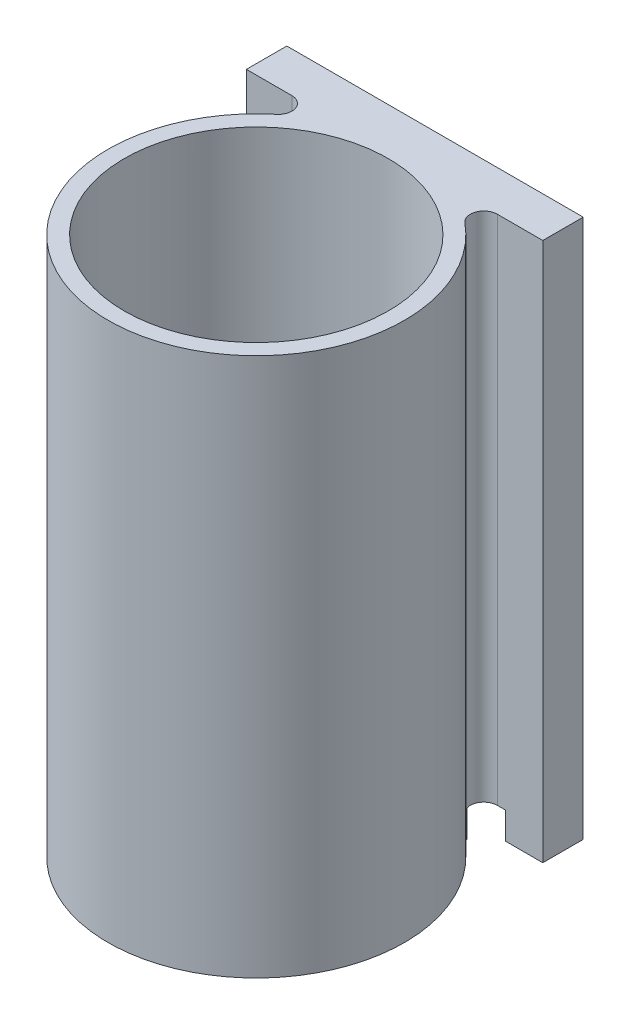
ISO-10303-21;
HEADER;
FILE_DESCRIPTION(('STEP AP214'),'2;1');
FILE_NAME('part.step','',(''),(''),'','','');
FILE_SCHEMA(('AUTOMOTIVE_DESIGN { 1 0 10303 214 1 1 1 1 }'));
ENDSEC;
DATA;
#1=APPLICATION_CONTEXT('core data for automotive mechanical design processes');
#2=APPLICATION_PROTOCOL_DEFINITION('international standard','automotive_design',2000,#1);
#3=PRODUCT_CONTEXT('',#1,'mechanical');
#4=PRODUCT('Part','Part','',(#3));
#5=PRODUCT_RELATED_PRODUCT_CATEGORY('part','',(#4));
#6=PRODUCT_DEFINITION_FORMATION('','',#4);
#7=PRODUCT_DEFINITION_CONTEXT('part definition',#1,'design');
#8=PRODUCT_DEFINITION('design','',#6,#7);
#9=PRODUCT_DEFINITION_SHAPE('','',#8);
#10=(LENGTH_UNIT() NAMED_UNIT(*) SI_UNIT(.MILLI.,.METRE.));
#11=(NAMED_UNIT(*) PLANE_ANGLE_UNIT() SI_UNIT($,.RADIAN.));
#12=(NAMED_UNIT(*) SI_UNIT($,.STERADIAN.) SOLID_ANGLE_UNIT());
#13=UNCERTAINTY_MEASURE_WITH_UNIT(LENGTH_MEASURE(1.E-05),#10,'distance_accuracy_value','');
#14=(GEOMETRIC_REPRESENTATION_CONTEXT(3) GLOBAL_UNCERTAINTY_ASSIGNED_CONTEXT((#13)) GLOBAL_UNIT_ASSIGNED_CONTEXT((#10,
#11,#12)) REPRESENTATION_CONTEXT('',''));
#15=CARTESIAN_POINT('',(0.,0.,0.));
#16=DIRECTION('',(0.,0.,1.));
#17=DIRECTION('',(1.,0.,0.));
#18=AXIS2_PLACEMENT_3D('',#15,#16,#17);
#19=CARTESIAN_POINT('',(-11.,-20.,3.));
#20=DIRECTION('',(0.,1.,0.));
#21=DIRECTION('',(0.,0.,1.));
#22=AXIS2_PLACEMENT_3D('',#19,#20,#21);
#23=PLANE('',#22);
#24=DIRECTION('',(1.,0.,0.));
#25=VECTOR('',#24,1.);
#26=CARTESIAN_POINT('',(-11.,-20.,3.));
#27=LINE('',#26,#25);
#28=CARTESIAN_POINT('',(8.23143797908715,-20.,3.));
#29=VERTEX_POINT('',#28);
#30=CARTESIAN_POINT('',(11.,-20.,3.));
#31=VERTEX_POINT('',#30);
#32=EDGE_CURVE('E160',#29,#31,#27,.T.);
#33=ORIENTED_EDGE('',*,*,#32,.F.);
#34=DIRECTION('',(0.,0.,1.));
#35=VECTOR('',#34,1.);
#36=CARTESIAN_POINT('',(8.23143797908715,-20.,-4.29535614519713));
#37=LINE('',#36,#35);
#38=CARTESIAN_POINT('',(8.23143797908715,-20.,0.));
#39=VERTEX_POINT('',#38);
#40=EDGE_CURVE('E148',#39,#29,#37,.T.);
#41=ORIENTED_EDGE('',*,*,#40,.F.);
#42=DIRECTION('',(1.,0.,0.));
#43=VECTOR('',#42,1.);
#44=CARTESIAN_POINT('',(-11.,-20.,0.));
#45=LINE('',#44,#43);
#46=CARTESIAN_POINT('',(11.,-20.,0.));
#47=VERTEX_POINT('',#46);
#48=EDGE_CURVE('E158',#39,#47,#45,.T.);
#49=ORIENTED_EDGE('',*,*,#48,.T.);
#50=DIRECTION('',(0.,0.,-1.));
#51=VECTOR('',#50,1.);
#52=CARTESIAN_POINT('',(11.,-20.,3.));
#53=LINE('',#52,#51);
#54=EDGE_CURVE('E176',#31,#47,#53,.T.);
#55=ORIENTED_EDGE('',*,*,#54,.F.);
#56=EDGE_LOOP('',(#33,#41,#49,#55));
#57=FACE_BOUND('',#56,.T.);
#58=ADVANCED_FACE('F33',(#57),#23,.F.);
#59=CARTESIAN_POINT('',(-11.,-20.,0.));
#60=VERTEX_POINT('',#59);
#61=CARTESIAN_POINT('',(-8.23143797908715,-20.,0.));
#62=VERTEX_POINT('',#61);
#63=EDGE_CURVE('E167',#60,#62,#45,.T.);
#64=ORIENTED_EDGE('',*,*,#63,.T.);
#65=DIRECTION('',(0.,0.,-1.));
#66=VECTOR('',#65,1.);
#67=CARTESIAN_POINT('',(-8.23143797908715,-20.,-4.29535614519713));
#68=LINE('',#67,#66);
#69=CARTESIAN_POINT('',(-8.23143797908715,-20.,3.));
#70=VERTEX_POINT('',#69);
#71=EDGE_CURVE('E223',#70,#62,#68,.T.);
#72=ORIENTED_EDGE('',*,*,#71,.F.);
#73=CARTESIAN_POINT('',(-11.,-20.,3.));
#74=VERTEX_POINT('',#73);
#75=EDGE_CURVE('E179',#74,#70,#27,.T.);
#76=ORIENTED_EDGE('',*,*,#75,.F.);
#77=DIRECTION('',(0.,0.,-1.));
#78=VECTOR('',#77,1.);
#79=CARTESIAN_POINT('',(-11.,-20.,3.));
#80=LINE('',#79,#78);
#81=EDGE_CURVE('E178',#74,#60,#80,.T.);
#82=ORIENTED_EDGE('',*,*,#81,.T.);
#83=EDGE_LOOP('',(#64,#72,#76,#82));
#84=FACE_BOUND('',#83,.T.);
#85=ADVANCED_FACE('F221',(#84),#23,.F.);
#86=CARTESIAN_POINT('',(0.,0.,3.));
#87=DIRECTION('',(0.,0.,1.));
#88=DIRECTION('',(1.,0.,0.));
#89=AXIS2_PLACEMENT_3D('',#86,#87,#88);
#90=PLANE('',#89);
#91=DIRECTION('',(0.,1.,0.));
#92=VECTOR('',#91,1.);
#93=CARTESIAN_POINT('',(8.23143797908715,0.,3.));
#94=LINE('',#93,#92);
#95=CARTESIAN_POINT('',(8.23143797908715,-18.,3.));
#96=VERTEX_POINT('',#95);
#97=EDGE_CURVE('E258',#29,#96,#94,.T.);
#98=ORIENTED_EDGE('',*,*,#97,.F.);
#99=ORIENTED_EDGE('',*,*,#32,.T.);
#100=DIRECTION('',(0.,1.,0.));
#101=VECTOR('',#100,1.);
#102=CARTESIAN_POINT('',(11.,20.,3.));
#103=LINE('',#102,#101);
#104=CARTESIAN_POINT('',(11.,20.,3.));
#105=VERTEX_POINT('',#104);
#106=EDGE_CURVE('E171',#31,#105,#103,.T.);
#107=ORIENTED_EDGE('',*,*,#106,.T.);
#108=DIRECTION('',(-1.,0.,0.));
#109=VECTOR('',#108,1.);
#110=CARTESIAN_POINT('',(-11.,20.,3.));
#111=LINE('',#110,#109);
#112=CARTESIAN_POINT('',(7.62294279292166,20.,3.));
#113=VERTEX_POINT('',#112);
#114=EDGE_CURVE('E236',#105,#113,#111,.T.);
#115=ORIENTED_EDGE('',*,*,#114,.T.);
#116=DIRECTION('',(0.,-1.,0.));
#117=VECTOR('',#116,1.);
#118=CARTESIAN_POINT('',(7.62294279292166,-20.,3.));
#119=LINE('',#118,#117);
#120=CARTESIAN_POINT('',(7.62294279292166,-18.,3.));
#121=VERTEX_POINT('',#120);
#122=EDGE_CURVE('E194',#113,#121,#119,.T.);
#123=ORIENTED_EDGE('',*,*,#122,.T.);
#124=DIRECTION('',(-1.,0.,0.));
#125=VECTOR('',#124,1.);
#126=CARTESIAN_POINT('',(0.,-18.,3.));
#127=LINE('',#126,#125);
#128=EDGE_CURVE('E277',#96,#121,#127,.T.);
#129=ORIENTED_EDGE('',*,*,#128,.F.);
#130=EDGE_LOOP('',(#98,#99,#107,#115,#123,#129));
#131=FACE_BOUND('',#130,.T.);
#132=ADVANCED_FACE('F294',(#131),#90,.T.);
#133=CARTESIAN_POINT('',(11.,20.,3.));
#134=DIRECTION('',(-1.,0.,0.));
#135=DIRECTION('',(0.,-1.,0.));
#136=AXIS2_PLACEMENT_3D('',#133,#134,#135);
#137=PLANE('',#136);
#138=DIRECTION('',(0.,1.,0.));
#139=VECTOR('',#138,1.);
#140=CARTESIAN_POINT('',(11.,20.,0.));
#141=LINE('',#140,#139);
#142=CARTESIAN_POINT('',(11.,20.,0.));
#143=VERTEX_POINT('',#142);
#144=EDGE_CURVE('E166',#47,#143,#141,.T.);
#145=ORIENTED_EDGE('',*,*,#144,.T.);
#146=DIRECTION('',(0.,0.,-1.));
#147=VECTOR('',#146,1.);
#148=CARTESIAN_POINT('',(11.,20.,3.));
#149=LINE('',#148,#147);
#150=EDGE_CURVE('E185',#105,#143,#149,.T.);
#151=ORIENTED_EDGE('',*,*,#150,.F.);
#152=ORIENTED_EDGE('',*,*,#106,.F.);
#153=ORIENTED_EDGE('',*,*,#54,.T.);
#154=EDGE_LOOP('',(#145,#151,#152,#153));
#155=FACE_BOUND('',#154,.T.);
#156=ADVANCED_FACE('F240',(#155),#137,.F.);
#157=CARTESIAN_POINT('',(-11.,20.,3.));
#158=DIRECTION('',(0.,-1.,0.));
#159=DIRECTION('',(0.,0.,-1.));
#160=AXIS2_PLACEMENT_3D('',#157,#158,#159);
#161=PLANE('',#160);
#162=CARTESIAN_POINT('',(-7.62294279292166,20.,3.));
#163=VERTEX_POINT('',#162);
#164=CARTESIAN_POINT('',(-11.,20.,3.));
#165=VERTEX_POINT('',#164);
#166=EDGE_CURVE('E250',#163,#165,#111,.T.);
#167=ORIENTED_EDGE('',*,*,#166,.F.);
#168=CARTESIAN_POINT('',(-7.62294279292166,20.,4.));
#169=DIRECTION('',(0.,-1.,0.));
#170=DIRECTION('',(0.,0.,-1.));
#171=AXIS2_PLACEMENT_3D('',#168,#169,#170);
#172=CIRCLE('',#171,1.);
#173=CARTESIAN_POINT('',(-6.98769756017818,20.,4.77231049084982));
#174=VERTEX_POINT('',#173);
#175=EDGE_CURVE('E205',#163,#174,#172,.T.);
#176=ORIENTED_EDGE('',*,*,#175,.T.);
#177=CARTESIAN_POINT('',(0.,20.,13.2677258901979));
#178=DIRECTION('',(0.,1.,0.));
#179=DIRECTION('',(0.,0.,1.));
#180=AXIS2_PLACEMENT_3D('',#177,#178,#179);
#181=CIRCLE('',#180,11.);
#182=CARTESIAN_POINT('',(6.98769756017818,20.,4.77231049084982));
#183=VERTEX_POINT('',#182);
#184=EDGE_CURVE('E244',#174,#183,#181,.T.);
#185=ORIENTED_EDGE('',*,*,#184,.T.);
#186=CARTESIAN_POINT('',(7.62294279292166,20.,4.));
#187=DIRECTION('',(0.,-1.,0.));
#188=DIRECTION('',(0.,0.,-1.));
#189=AXIS2_PLACEMENT_3D('',#186,#187,#188);
#190=CIRCLE('',#189,1.);
#191=EDGE_CURVE('E198',#183,#113,#190,.T.);
#192=ORIENTED_EDGE('',*,*,#191,.T.);
#193=ORIENTED_EDGE('',*,*,#114,.F.);
#194=ORIENTED_EDGE('',*,*,#150,.T.);
#195=DIRECTION('',(-1.,0.,0.));
#196=VECTOR('',#195,1.);
#197=CARTESIAN_POINT('',(-11.,20.,0.));
#198=LINE('',#197,#196);
#199=CARTESIAN_POINT('',(-11.,20.,0.));
#200=VERTEX_POINT('',#199);
#201=EDGE_CURVE('E172',#143,#200,#198,.T.);
#202=ORIENTED_EDGE('',*,*,#201,.T.);
#203=DIRECTION('',(0.,0.,-1.));
#204=VECTOR('',#203,1.);
#205=CARTESIAN_POINT('',(-11.,20.,3.));
#206=LINE('',#205,#204);
#207=EDGE_CURVE('E182',#165,#200,#206,.T.);
#208=ORIENTED_EDGE('',*,*,#207,.F.);
#209=EDGE_LOOP('',(#167,#176,#185,#192,#193,#194,#202,#208));
#210=FACE_BOUND('',#209,.T.);
#211=CARTESIAN_POINT('',(0.,20.,13.2677258901979));
#212=DIRECTION('',(0.,1.,0.));
#213=DIRECTION('',(0.,0.,1.));
#214=AXIS2_PLACEMENT_3D('',#211,#212,#213);
#215=CIRCLE('',#214,9.8);
#216=CARTESIAN_POINT('',(0.,20.,23.0677258901979));
#217=VERTEX_POINT('',#216);
#218=EDGE_CURVE('E255',#217,#217,#215,.T.);
#219=ORIENTED_EDGE('',*,*,#218,.F.);
#220=EDGE_LOOP('',(#219));
#221=FACE_BOUND('',#220,.T.);
#222=ADVANCED_FACE('F233',(#210,#221),#161,.F.);
#223=CARTESIAN_POINT('',(-11.,20.,3.));
#224=DIRECTION('',(1.,0.,0.));
#225=DIRECTION('',(0.,1.,0.));
#226=AXIS2_PLACEMENT_3D('',#223,#224,#225);
#227=PLANE('',#226);
#228=DIRECTION('',(0.,-1.,0.));
#229=VECTOR('',#228,1.);
#230=CARTESIAN_POINT('',(-11.,20.,0.));
#231=LINE('',#230,#229);
#232=EDGE_CURVE('E168',#200,#60,#231,.T.);
#233=ORIENTED_EDGE('',*,*,#232,.T.);
#234=ORIENTED_EDGE('',*,*,#81,.F.);
#235=DIRECTION('',(0.,-1.,0.));
#236=VECTOR('',#235,1.);
#237=CARTESIAN_POINT('',(-11.,20.,3.));
#238=LINE('',#237,#236);
#239=EDGE_CURVE('E229',#165,#74,#238,.T.);
#240=ORIENTED_EDGE('',*,*,#239,.F.);
#241=ORIENTED_EDGE('',*,*,#207,.T.);
#242=EDGE_LOOP('',(#233,#234,#240,#241));
#243=FACE_BOUND('',#242,.T.);
#244=ADVANCED_FACE('F228',(#243),#227,.F.);
#245=CARTESIAN_POINT('',(-7.62294279292166,-20.,4.));
#246=DIRECTION('',(0.,1.,0.));
#247=DIRECTION('',(0.,0.,1.));
#248=AXIS2_PLACEMENT_3D('',#245,#246,#247);
#249=CIRCLE('',#248,1.);
#250=CARTESIAN_POINT('',(-6.98769756017818,-20.,4.77231049084982));
#251=VERTEX_POINT('',#250);
#252=CARTESIAN_POINT('',(-6.66755556907245,-20.,4.29535614519713));
#253=VERTEX_POINT('',#252);
#254=EDGE_CURVE('E202',#251,#253,#249,.T.);
#255=ORIENTED_EDGE('',*,*,#254,.T.);
#256=DIRECTION('',(-1.,0.,0.));
#257=VECTOR('',#256,1.);
#258=CARTESIAN_POINT('',(-8.23143797908715,-20.,4.29535614519713));
#259=LINE('',#258,#257);
#260=CARTESIAN_POINT('',(-3.94164701095816,-20.,4.29535614519713));
#261=VERTEX_POINT('',#260);
#262=EDGE_CURVE('E161',#261,#253,#259,.T.);
#263=ORIENTED_EDGE('',*,*,#262,.F.);
#264=CARTESIAN_POINT('',(0.,-20.,13.2677258901979));
#265=DIRECTION('',(0.,1.,0.));
#266=DIRECTION('',(0.,0.,1.));
#267=AXIS2_PLACEMENT_3D('',#264,#265,#266);
#268=CIRCLE('',#267,9.8);
#269=CARTESIAN_POINT('',(3.94164701095816,-20.,4.29535614519713));
#270=VERTEX_POINT('',#269);
#271=EDGE_CURVE('E253',#261,#270,#268,.T.);
#272=ORIENTED_EDGE('',*,*,#271,.T.);
#273=CARTESIAN_POINT('',(6.66755556907245,-20.,4.29535614519713));
#274=VERTEX_POINT('',#273);
#275=EDGE_CURVE('E286',#274,#270,#259,.T.);
#276=ORIENTED_EDGE('',*,*,#275,.F.);
#277=CARTESIAN_POINT('',(7.62294279292166,-20.,4.));
#278=DIRECTION('',(0.,1.,0.));
#279=DIRECTION('',(0.,0.,1.));
#280=AXIS2_PLACEMENT_3D('',#277,#278,#279);
#281=CIRCLE('',#280,1.);
#282=CARTESIAN_POINT('',(6.98769756017818,-20.,4.77231049084982));
#283=VERTEX_POINT('',#282);
#284=EDGE_CURVE('E200',#274,#283,#281,.T.);
#285=ORIENTED_EDGE('',*,*,#284,.T.);
#286=CARTESIAN_POINT('',(0.,-20.,13.2677258901979));
#287=DIRECTION('',(0.,1.,0.));
#288=DIRECTION('',(0.,0.,1.));
#289=AXIS2_PLACEMENT_3D('',#286,#287,#288);
#290=CIRCLE('',#289,11.);
#291=EDGE_CURVE('E241',#251,#283,#290,.T.);
#292=ORIENTED_EDGE('',*,*,#291,.F.);
#293=EDGE_LOOP('',(#255,#263,#272,#276,#285,#292));
#294=FACE_BOUND('',#293,.T.);
#295=ADVANCED_FACE('F311',(#294),#23,.F.);
#296=DIRECTION('',(0.,-1.,0.));
#297=VECTOR('',#296,1.);
#298=CARTESIAN_POINT('',(-8.23143797908715,0.,3.));
#299=LINE('',#298,#297);
#300=CARTESIAN_POINT('',(-8.23143797908715,-18.,3.));
#301=VERTEX_POINT('',#300);
#302=EDGE_CURVE('E262',#301,#70,#299,.T.);
#303=ORIENTED_EDGE('',*,*,#302,.F.);
#304=DIRECTION('',(-1.,0.,0.));
#305=VECTOR('',#304,1.);
#306=CARTESIAN_POINT('',(0.,-18.,3.));
#307=LINE('',#306,#305);
#308=CARTESIAN_POINT('',(-7.62294279292166,-18.,3.));
#309=VERTEX_POINT('',#308);
#310=EDGE_CURVE('E282',#309,#301,#307,.T.);
#311=ORIENTED_EDGE('',*,*,#310,.F.);
#312=DIRECTION('',(0.,-1.,0.));
#313=VECTOR('',#312,1.);
#314=CARTESIAN_POINT('',(-7.62294279292166,20.,3.));
#315=LINE('',#314,#313);
#316=EDGE_CURVE('E56',#309,#163,#315,.F.);
#317=ORIENTED_EDGE('',*,*,#316,.T.);
#318=ORIENTED_EDGE('',*,*,#166,.T.);
#319=ORIENTED_EDGE('',*,*,#239,.T.);
#320=ORIENTED_EDGE('',*,*,#75,.T.);
#321=EDGE_LOOP('',(#303,#311,#317,#318,#319,#320));
#322=FACE_BOUND('',#321,.T.);
#323=ADVANCED_FACE('F319',(#322),#90,.T.);
#324=CARTESIAN_POINT('',(0.,0.,0.));
#325=DIRECTION('',(0.,0.,1.));
#326=DIRECTION('',(1.,0.,0.));
#327=AXIS2_PLACEMENT_3D('',#324,#325,#326);
#328=PLANE('',#327);
#329=ORIENTED_EDGE('',*,*,#48,.F.);
#330=DIRECTION('',(0.,1.,0.));
#331=VECTOR('',#330,1.);
#332=CARTESIAN_POINT('',(8.23143797908715,0.,0.));
#333=LINE('',#332,#331);
#334=CARTESIAN_POINT('',(8.23143797908715,-18.,0.));
#335=VERTEX_POINT('',#334);
#336=EDGE_CURVE('E11',#39,#335,#333,.T.);
#337=ORIENTED_EDGE('',*,*,#336,.T.);
#338=DIRECTION('',(-1.,0.,0.));
#339=VECTOR('',#338,1.);
#340=CARTESIAN_POINT('',(0.,-18.,0.));
#341=LINE('',#340,#339);
#342=CARTESIAN_POINT('',(-8.23143797908715,-18.,0.));
#343=VERTEX_POINT('',#342);
#344=EDGE_CURVE('E215',#335,#343,#341,.T.);
#345=ORIENTED_EDGE('',*,*,#344,.T.);
#346=DIRECTION('',(0.,-1.,0.));
#347=VECTOR('',#346,1.);
#348=CARTESIAN_POINT('',(-8.23143797908715,0.,0.));
#349=LINE('',#348,#347);
#350=EDGE_CURVE('E41',#343,#62,#349,.T.);
#351=ORIENTED_EDGE('',*,*,#350,.T.);
#352=ORIENTED_EDGE('',*,*,#63,.F.);
#353=ORIENTED_EDGE('',*,*,#232,.F.);
#354=ORIENTED_EDGE('',*,*,#201,.F.);
#355=ORIENTED_EDGE('',*,*,#144,.F.);
#356=EDGE_LOOP('',(#329,#337,#345,#351,#352,#353,#354,#355));
#357=FACE_BOUND('',#356,.T.);
#358=ADVANCED_FACE('F164',(#357),#328,.F.);
#359=CARTESIAN_POINT('',(0.,-20.,13.2677258901979));
#360=DIRECTION('',(0.,1.,0.));
#361=DIRECTION('',(0.,0.,1.));
#362=AXIS2_PLACEMENT_3D('',#359,#360,#361);
#363=CYLINDRICAL_SURFACE('',#362,11.);
#364=ORIENTED_EDGE('',*,*,#291,.T.);
#365=DIRECTION('',(0.,1.,0.));
#366=VECTOR('',#365,1.);
#367=CARTESIAN_POINT('',(6.98769756017818,-20.,4.77231049084982));
#368=LINE('',#367,#366);
#369=EDGE_CURVE('E191',#283,#183,#368,.T.);
#370=ORIENTED_EDGE('',*,*,#369,.T.);
#371=ORIENTED_EDGE('',*,*,#184,.F.);
#372=DIRECTION('',(0.,1.,0.));
#373=VECTOR('',#372,1.);
#374=CARTESIAN_POINT('',(-6.98769756017818,-20.,4.77231049084982));
#375=LINE('',#374,#373);
#376=EDGE_CURVE('E188',#174,#251,#375,.F.);
#377=ORIENTED_EDGE('',*,*,#376,.T.);
#378=EDGE_LOOP('',(#364,#370,#371,#377));
#379=FACE_BOUND('',#378,.T.);
#380=ADVANCED_FACE('F354',(#379),#363,.T.);
#381=CARTESIAN_POINT('',(0.,-20.,13.2677258901979));
#382=DIRECTION('',(0.,1.,0.));
#383=DIRECTION('',(0.,0.,1.));
#384=AXIS2_PLACEMENT_3D('',#381,#382,#383);
#385=CYLINDRICAL_SURFACE('',#384,9.8);
#386=CARTESIAN_POINT('',(0.,-18.,13.2677258901979));
#387=DIRECTION('',(0.,1.,0.));
#388=DIRECTION('',(0.,0.,1.));
#389=AXIS2_PLACEMENT_3D('',#386,#387,#388);
#390=CIRCLE('',#389,9.8);
#391=CARTESIAN_POINT('',(-3.94164701095816,-18.,4.29535614519713));
#392=VERTEX_POINT('',#391);
#393=CARTESIAN_POINT('',(3.94164701095816,-18.,4.29535614519713));
#394=VERTEX_POINT('',#393);
#395=EDGE_CURVE('E274',#392,#394,#390,.F.);
#396=ORIENTED_EDGE('',*,*,#395,.T.);
#397=DIRECTION('',(0.,1.,0.));
#398=VECTOR('',#397,1.);
#399=CARTESIAN_POINT('',(3.94164701095816,-20.,4.29535614519713));
#400=LINE('',#399,#398);
#401=EDGE_CURVE('E264',#394,#270,#400,.F.);
#402=ORIENTED_EDGE('',*,*,#401,.T.);
#403=ORIENTED_EDGE('',*,*,#271,.F.);
#404=DIRECTION('',(0.,1.,0.));
#405=VECTOR('',#404,1.);
#406=CARTESIAN_POINT('',(-3.94164701095816,-20.,4.29535614519713));
#407=LINE('',#406,#405);
#408=EDGE_CURVE('E267',#261,#392,#407,.T.);
#409=ORIENTED_EDGE('',*,*,#408,.T.);
#410=EDGE_LOOP('',(#396,#402,#403,#409));
#411=FACE_BOUND('',#410,.T.);
#412=ORIENTED_EDGE('',*,*,#218,.T.);
#413=EDGE_LOOP('',(#412));
#414=FACE_BOUND('',#413,.T.);
#415=ADVANCED_FACE('F307',(#411,#414),#385,.F.);
#416=CARTESIAN_POINT('',(7.62294279292166,-20.,4.));
#417=DIRECTION('',(0.,1.,0.));
#418=DIRECTION('',(0.,0.,1.));
#419=AXIS2_PLACEMENT_3D('',#416,#417,#418);
#420=CYLINDRICAL_SURFACE('',#419,1.);
#421=ORIENTED_EDGE('',*,*,#284,.F.);
#422=DIRECTION('',(0.,1.,0.));
#423=VECTOR('',#422,1.);
#424=CARTESIAN_POINT('',(6.66755556907245,-20.,4.29535614519713));
#425=LINE('',#424,#423);
#426=CARTESIAN_POINT('',(6.66755556907245,-18.,4.29535614519713));
#427=VERTEX_POINT('',#426);
#428=EDGE_CURVE('E270',#274,#427,#425,.T.);
#429=ORIENTED_EDGE('',*,*,#428,.T.);
#430=CARTESIAN_POINT('',(7.62294279292166,-18.,4.));
#431=DIRECTION('',(0.,1.,0.));
#432=DIRECTION('',(0.,0.,1.));
#433=AXIS2_PLACEMENT_3D('',#430,#431,#432);
#434=CIRCLE('',#433,1.);
#435=EDGE_CURVE('E279',#427,#121,#434,.F.);
#436=ORIENTED_EDGE('',*,*,#435,.T.);
#437=ORIENTED_EDGE('',*,*,#122,.F.);
#438=ORIENTED_EDGE('',*,*,#191,.F.);
#439=ORIENTED_EDGE('',*,*,#369,.F.);
#440=EDGE_LOOP('',(#421,#429,#436,#437,#438,#439));
#441=FACE_BOUND('',#440,.T.);
#442=ADVANCED_FACE('F298',(#441),#420,.F.);
#443=CARTESIAN_POINT('',(-7.62294279292166,-20.,4.));
#444=DIRECTION('',(0.,1.,0.));
#445=DIRECTION('',(0.,0.,1.));
#446=AXIS2_PLACEMENT_3D('',#443,#444,#445);
#447=CYLINDRICAL_SURFACE('',#446,1.);
#448=CARTESIAN_POINT('',(-7.62294279292166,-18.,4.));
#449=DIRECTION('',(0.,1.,0.));
#450=DIRECTION('',(0.,0.,1.));
#451=AXIS2_PLACEMENT_3D('',#448,#449,#450);
#452=CIRCLE('',#451,1.);
#453=CARTESIAN_POINT('',(-6.66755556907245,-18.,4.29535614519713));
#454=VERTEX_POINT('',#453);
#455=EDGE_CURVE('E207',#309,#454,#452,.F.);
#456=ORIENTED_EDGE('',*,*,#455,.T.);
#457=DIRECTION('',(0.,1.,0.));
#458=VECTOR('',#457,1.);
#459=CARTESIAN_POINT('',(-6.66755556907245,-20.,4.29535614519713));
#460=LINE('',#459,#458);
#461=EDGE_CURVE('E210',#454,#253,#460,.F.);
#462=ORIENTED_EDGE('',*,*,#461,.T.);
#463=ORIENTED_EDGE('',*,*,#254,.F.);
#464=ORIENTED_EDGE('',*,*,#376,.F.);
#465=ORIENTED_EDGE('',*,*,#175,.F.);
#466=ORIENTED_EDGE('',*,*,#316,.F.);
#467=EDGE_LOOP('',(#456,#462,#463,#464,#465,#466));
#468=FACE_BOUND('',#467,.T.);
#469=ADVANCED_FACE('F35',(#468),#447,.F.);
#470=CARTESIAN_POINT('',(8.23143797908715,-18.,-4.29535614519713));
#471=DIRECTION('',(1.,0.,0.));
#472=DIRECTION('',(0.,0.,-1.));
#473=AXIS2_PLACEMENT_3D('',#470,#471,#472);
#474=PLANE('',#473);
#475=ORIENTED_EDGE('',*,*,#97,.T.);
#476=DIRECTION('',(0.,0.,1.));
#477=VECTOR('',#476,1.);
#478=CARTESIAN_POINT('',(8.23143797908715,-18.,-4.29535614519713));
#479=LINE('',#478,#477);
#480=EDGE_CURVE('E151',#335,#96,#479,.T.);
#481=ORIENTED_EDGE('',*,*,#480,.F.);
#482=ORIENTED_EDGE('',*,*,#336,.F.);
#483=ORIENTED_EDGE('',*,*,#40,.T.);
#484=EDGE_LOOP('',(#475,#481,#482,#483));
#485=FACE_BOUND('',#484,.T.);
#486=ADVANCED_FACE('F147',(#485),#474,.F.);
#487=CARTESIAN_POINT('',(-8.23143797908715,-18.,-4.29535614519713));
#488=DIRECTION('',(-1.,0.,0.));
#489=DIRECTION('',(0.,0.,1.));
#490=AXIS2_PLACEMENT_3D('',#487,#488,#489);
#491=PLANE('',#490);
#492=ORIENTED_EDGE('',*,*,#302,.T.);
#493=ORIENTED_EDGE('',*,*,#71,.T.);
#494=ORIENTED_EDGE('',*,*,#350,.F.);
#495=DIRECTION('',(0.,0.,-1.));
#496=VECTOR('',#495,1.);
#497=CARTESIAN_POINT('',(-8.23143797908715,-18.,-4.29535614519713));
#498=LINE('',#497,#496);
#499=EDGE_CURVE('E284',#301,#343,#498,.T.);
#500=ORIENTED_EDGE('',*,*,#499,.F.);
#501=EDGE_LOOP('',(#492,#493,#494,#500));
#502=FACE_BOUND('',#501,.T.);
#503=ADVANCED_FACE('F320',(#502),#491,.F.);
#504=CARTESIAN_POINT('',(-8.23143797908715,-18.,4.29535614519713));
#505=DIRECTION('',(0.,0.,1.));
#506=DIRECTION('',(1.,0.,0.));
#507=AXIS2_PLACEMENT_3D('',#504,#505,#506);
#508=PLANE('',#507);
#509=DIRECTION('',(-1.,0.,0.));
#510=VECTOR('',#509,1.);
#511=CARTESIAN_POINT('',(-8.23143797908715,-18.,4.29535614519713));
#512=LINE('',#511,#510);
#513=EDGE_CURVE('E289',#427,#394,#512,.T.);
#514=ORIENTED_EDGE('',*,*,#513,.F.);
#515=ORIENTED_EDGE('',*,*,#428,.F.);
#516=ORIENTED_EDGE('',*,*,#275,.T.);
#517=ORIENTED_EDGE('',*,*,#401,.F.);
#518=EDGE_LOOP('',(#514,#515,#516,#517));
#519=FACE_BOUND('',#518,.T.);
#520=ADVANCED_FACE('F303',(#519),#508,.F.);
#521=ORIENTED_EDGE('',*,*,#262,.T.);
#522=ORIENTED_EDGE('',*,*,#461,.F.);
#523=EDGE_CURVE('E48',#392,#454,#512,.T.);
#524=ORIENTED_EDGE('',*,*,#523,.F.);
#525=ORIENTED_EDGE('',*,*,#408,.F.);
#526=EDGE_LOOP('',(#521,#522,#524,#525));
#527=FACE_BOUND('',#526,.T.);
#528=ADVANCED_FACE('F314',(#527),#508,.F.);
#529=CARTESIAN_POINT('',(0.,-18.,0.));
#530=DIRECTION('',(0.,1.,0.));
#531=DIRECTION('',(0.,0.,1.));
#532=AXIS2_PLACEMENT_3D('',#529,#530,#531);
#533=PLANE('',#532);
#534=ORIENTED_EDGE('',*,*,#480,.T.);
#535=ORIENTED_EDGE('',*,*,#128,.T.);
#536=ORIENTED_EDGE('',*,*,#435,.F.);
#537=ORIENTED_EDGE('',*,*,#513,.T.);
#538=ORIENTED_EDGE('',*,*,#395,.F.);
#539=ORIENTED_EDGE('',*,*,#523,.T.);
#540=ORIENTED_EDGE('',*,*,#455,.F.);
#541=ORIENTED_EDGE('',*,*,#310,.T.);
#542=ORIENTED_EDGE('',*,*,#499,.T.);
#543=ORIENTED_EDGE('',*,*,#344,.F.);
#544=EDGE_LOOP('',(#534,#535,#536,#537,#538,#539,#540,#541,#542,#543));
#545=FACE_BOUND('',#544,.T.);
#546=ADVANCED_FACE('F292',(#545),#533,.F.);
#547=CLOSED_SHELL('',(#58,#85,#132,#156,#222,#244,#295,#323,#358,#380,#415,#442,#469,#486,#503,
#520,#528,#546));
#548=MANIFOLD_SOLID_BREP('B2',#547);
#549=ADVANCED_BREP_SHAPE_REPRESENTATION('',(#18,#548),#14);
#550=SHAPE_DEFINITION_REPRESENTATION(#9,#549);
ENDSEC;
END-ISO-10303-21;
